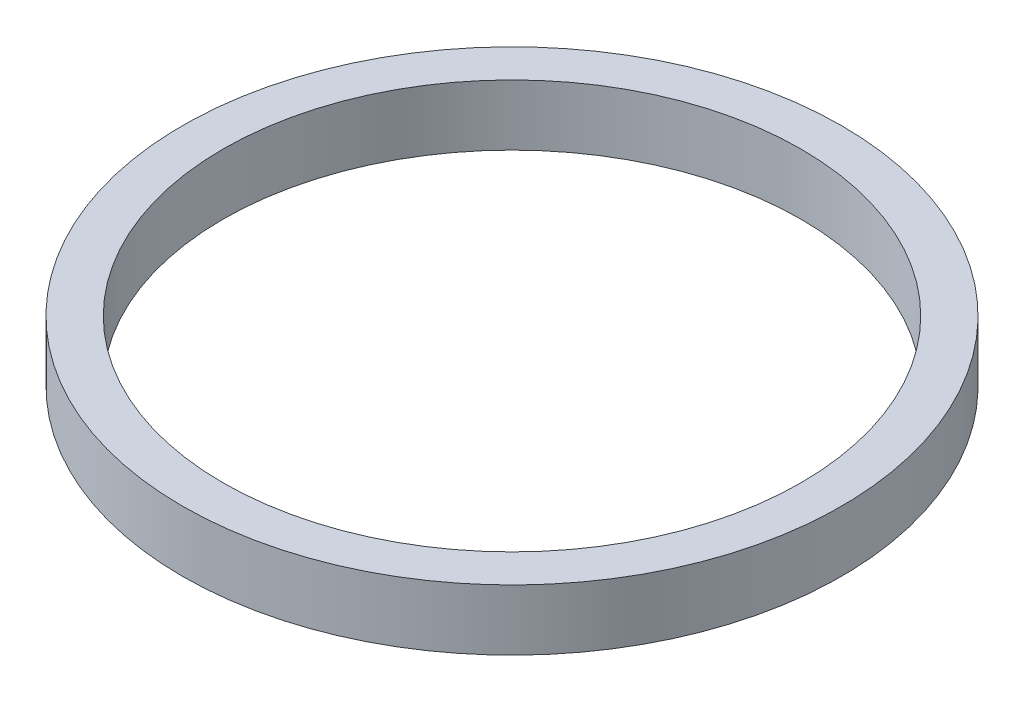
ISO-10303-21;
HEADER;
FILE_DESCRIPTION(('STEP AP214'),'2;1');
FILE_NAME('part.step','',(''),(''),'','','');
FILE_SCHEMA(('AUTOMOTIVE_DESIGN { 1 0 10303 214 1 1 1 1 }'));
ENDSEC;
DATA;
#1=APPLICATION_CONTEXT('core data for automotive mechanical design processes');
#2=APPLICATION_PROTOCOL_DEFINITION('international standard','automotive_design',2000,#1);
#3=PRODUCT_CONTEXT('',#1,'mechanical');
#4=PRODUCT('Part','Part','',(#3));
#5=PRODUCT_RELATED_PRODUCT_CATEGORY('part','',(#4));
#6=PRODUCT_DEFINITION_FORMATION('','',#4);
#7=PRODUCT_DEFINITION_CONTEXT('part definition',#1,'design');
#8=PRODUCT_DEFINITION('design','',#6,#7);
#9=PRODUCT_DEFINITION_SHAPE('','',#8);
#10=(LENGTH_UNIT() NAMED_UNIT(*) SI_UNIT(.MILLI.,.METRE.));
#11=(NAMED_UNIT(*) PLANE_ANGLE_UNIT() SI_UNIT($,.RADIAN.));
#12=(NAMED_UNIT(*) SI_UNIT($,.STERADIAN.) SOLID_ANGLE_UNIT());
#13=UNCERTAINTY_MEASURE_WITH_UNIT(LENGTH_MEASURE(1.E-05),#10,'distance_accuracy_value','');
#14=(GEOMETRIC_REPRESENTATION_CONTEXT(3) GLOBAL_UNCERTAINTY_ASSIGNED_CONTEXT((#13)) GLOBAL_UNIT_ASSIGNED_CONTEXT((#10,
#11,#12)) REPRESENTATION_CONTEXT('',''));
#15=CARTESIAN_POINT('',(0.,0.,0.));
#16=DIRECTION('',(0.,0.,1.));
#17=DIRECTION('',(1.,0.,0.));
#18=AXIS2_PLACEMENT_3D('',#15,#16,#17);
#19=CARTESIAN_POINT('',(0.,3.,0.));
#20=DIRECTION('',(0.,1.,0.));
#21=DIRECTION('',(0.,0.,1.));
#22=AXIS2_PLACEMENT_3D('',#19,#20,#21);
#23=PLANE('',#22);
#24=CARTESIAN_POINT('',(0.,3.,0.));
#25=DIRECTION('',(0.,1.,0.));
#26=DIRECTION('',(0.,0.,1.));
#27=AXIS2_PLACEMENT_3D('',#24,#25,#26);
#28=CIRCLE('',#27,16.2625);
#29=CARTESIAN_POINT('',(0.,3.,16.2625));
#30=VERTEX_POINT('',#29);
#31=EDGE_CURVE('E10',#30,#30,#28,.T.);
#32=ORIENTED_EDGE('',*,*,#31,.T.);
#33=EDGE_LOOP('',(#32));
#34=FACE_BOUND('',#33,.T.);
#35=CARTESIAN_POINT('',(0.,3.,0.));
#36=DIRECTION('',(0.,1.,0.));
#37=DIRECTION('',(0.,0.,1.));
#38=AXIS2_PLACEMENT_3D('',#35,#36,#37);
#39=CIRCLE('',#38,14.2625);
#40=CARTESIAN_POINT('',(0.,3.,14.2625));
#41=VERTEX_POINT('',#40);
#42=EDGE_CURVE('E42',#41,#41,#39,.T.);
#43=ORIENTED_EDGE('',*,*,#42,.F.);
#44=EDGE_LOOP('',(#43));
#45=FACE_BOUND('',#44,.T.);
#46=ADVANCED_FACE('F31',(#34,#45),#23,.T.);
#47=CARTESIAN_POINT('',(0.,0.,0.));
#48=DIRECTION('',(0.,1.,0.));
#49=DIRECTION('',(0.,0.,1.));
#50=AXIS2_PLACEMENT_3D('',#47,#48,#49);
#51=PLANE('',#50);
#52=CARTESIAN_POINT('',(0.,0.,0.));
#53=DIRECTION('',(0.,1.,0.));
#54=DIRECTION('',(0.,0.,1.));
#55=AXIS2_PLACEMENT_3D('',#52,#53,#54);
#56=CIRCLE('',#55,16.2625);
#57=CARTESIAN_POINT('',(0.,0.,16.2625));
#58=VERTEX_POINT('',#57);
#59=EDGE_CURVE('E35',#58,#58,#56,.T.);
#60=ORIENTED_EDGE('',*,*,#59,.F.);
#61=EDGE_LOOP('',(#60));
#62=FACE_BOUND('',#61,.T.);
#63=CARTESIAN_POINT('',(0.,0.,0.));
#64=DIRECTION('',(0.,1.,0.));
#65=DIRECTION('',(0.,0.,1.));
#66=AXIS2_PLACEMENT_3D('',#63,#64,#65);
#67=CIRCLE('',#66,14.2625);
#68=CARTESIAN_POINT('',(0.,0.,14.2625));
#69=VERTEX_POINT('',#68);
#70=EDGE_CURVE('E44',#69,#69,#67,.T.);
#71=ORIENTED_EDGE('',*,*,#70,.T.);
#72=EDGE_LOOP('',(#71));
#73=FACE_BOUND('',#72,.T.);
#74=ADVANCED_FACE('F54',(#62,#73),#51,.F.);
#75=CARTESIAN_POINT('',(0.,3.,0.));
#76=DIRECTION('',(0.,-1.,0.));
#77=DIRECTION('',(0.,0.,-1.));
#78=AXIS2_PLACEMENT_3D('',#75,#76,#77);
#79=CYLINDRICAL_SURFACE('',#78,16.2625);
#80=ORIENTED_EDGE('',*,*,#31,.F.);
#81=EDGE_LOOP('',(#80));
#82=FACE_BOUND('',#81,.T.);
#83=ORIENTED_EDGE('',*,*,#59,.T.);
#84=EDGE_LOOP('',(#83));
#85=FACE_BOUND('',#84,.T.);
#86=ADVANCED_FACE('F33',(#82,#85),#79,.T.);
#87=CARTESIAN_POINT('',(0.,3.,0.));
#88=DIRECTION('',(0.,-1.,0.));
#89=DIRECTION('',(0.,0.,-1.));
#90=AXIS2_PLACEMENT_3D('',#87,#88,#89);
#91=CYLINDRICAL_SURFACE('',#90,14.2625);
#92=ORIENTED_EDGE('',*,*,#42,.T.);
#93=EDGE_LOOP('',(#92));
#94=FACE_BOUND('',#93,.T.);
#95=ORIENTED_EDGE('',*,*,#70,.F.);
#96=EDGE_LOOP('',(#95));
#97=FACE_BOUND('',#96,.T.);
#98=ADVANCED_FACE('F50',(#94,#97),#91,.F.);
#99=CLOSED_SHELL('',(#46,#74,#86,#98));
#100=MANIFOLD_SOLID_BREP('B2',#99);
#101=ADVANCED_BREP_SHAPE_REPRESENTATION('',(#18,#100),#14);
#102=SHAPE_DEFINITION_REPRESENTATION(#9,#101);
ENDSEC;
END-ISO-10303-21;
